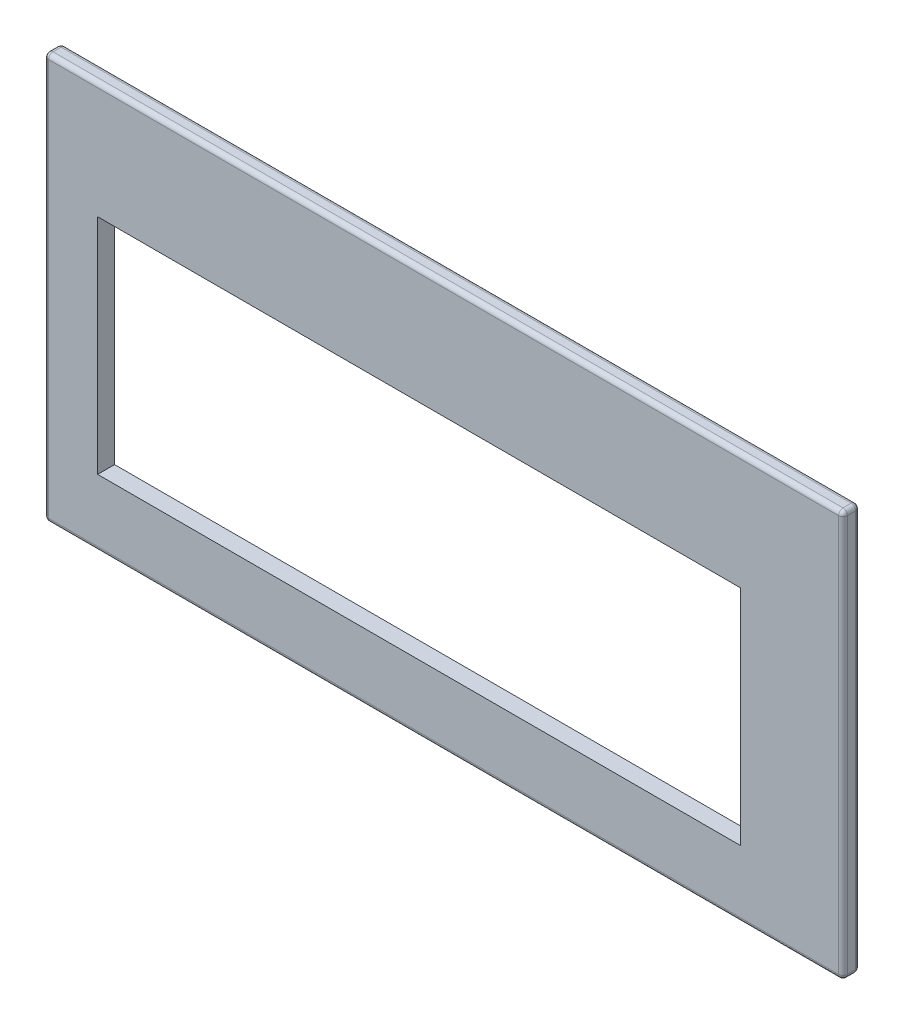
ISO-10303-21;
HEADER;
FILE_DESCRIPTION(('STEP AP214'),'2;1');
FILE_NAME('part.step','',(''),(''),'','','');
FILE_SCHEMA(('AUTOMOTIVE_DESIGN { 1 0 10303 214 1 1 1 1 }'));
ENDSEC;
DATA;
#1=APPLICATION_CONTEXT('core data for automotive mechanical design processes');
#2=APPLICATION_PROTOCOL_DEFINITION('international standard','automotive_design',2000,#1);
#3=PRODUCT_CONTEXT('',#1,'mechanical');
#4=PRODUCT('Part','Part','',(#3));
#5=PRODUCT_RELATED_PRODUCT_CATEGORY('part','',(#4));
#6=PRODUCT_DEFINITION_FORMATION('','',#4);
#7=PRODUCT_DEFINITION_CONTEXT('part definition',#1,'design');
#8=PRODUCT_DEFINITION('design','',#6,#7);
#9=PRODUCT_DEFINITION_SHAPE('','',#8);
#10=(LENGTH_UNIT() NAMED_UNIT(*) SI_UNIT(.MILLI.,.METRE.));
#11=(NAMED_UNIT(*) PLANE_ANGLE_UNIT() SI_UNIT($,.RADIAN.));
#12=(NAMED_UNIT(*) SI_UNIT($,.STERADIAN.) SOLID_ANGLE_UNIT());
#13=UNCERTAINTY_MEASURE_WITH_UNIT(LENGTH_MEASURE(1.E-05),#10,'distance_accuracy_value','');
#14=(GEOMETRIC_REPRESENTATION_CONTEXT(3) GLOBAL_UNCERTAINTY_ASSIGNED_CONTEXT((#13)) GLOBAL_UNIT_ASSIGNED_CONTEXT((#10,
#11,#12)) REPRESENTATION_CONTEXT('',''));
#15=CARTESIAN_POINT('',(0.,0.,0.));
#16=DIRECTION('',(0.,0.,1.));
#17=DIRECTION('',(1.,0.,0.));
#18=AXIS2_PLACEMENT_3D('',#15,#16,#17);
#19=CARTESIAN_POINT('',(-67.1122974680068,13.7448874974826,1.9));
#20=DIRECTION('',(1.,0.,0.));
#21=DIRECTION('',(0.,1.,0.));
#22=AXIS2_PLACEMENT_3D('',#19,#20,#21);
#23=PLANE('',#22);
#24=DIRECTION('',(0.,-1.,0.));
#25=VECTOR('',#24,1.);
#26=CARTESIAN_POINT('',(-67.1122974680068,13.7448874974826,1.4));
#27=LINE('',#26,#25);
#28=CARTESIAN_POINT('',(-67.1122974680068,-31.2551125025173,1.4));
#29=VERTEX_POINT('',#28);
#30=CARTESIAN_POINT('',(-67.1122974680068,13.2448874974826,1.4));
#31=VERTEX_POINT('',#30);
#32=EDGE_CURVE('E268',#29,#31,#27,.F.);
#33=ORIENTED_EDGE('',*,*,#32,.T.);
#34=DIRECTION('',(0.,0.,-1.));
#35=VECTOR('',#34,1.);
#36=CARTESIAN_POINT('',(-67.1122974680068,13.2448874974826,1.9));
#37=LINE('',#36,#35);
#38=CARTESIAN_POINT('',(-67.1122974680068,13.2448874974826,0.5));
#39=VERTEX_POINT('',#38);
#40=EDGE_CURVE('E271',#31,#39,#37,.T.);
#41=ORIENTED_EDGE('',*,*,#40,.T.);
#42=DIRECTION('',(0.,-1.,0.));
#43=VECTOR('',#42,1.);
#44=CARTESIAN_POINT('',(-67.1122974680068,13.7448874974826,0.5));
#45=LINE('',#44,#43);
#46=CARTESIAN_POINT('',(-67.1122974680068,-31.2551125025173,0.5));
#47=VERTEX_POINT('',#46);
#48=EDGE_CURVE('E260',#39,#47,#45,.T.);
#49=ORIENTED_EDGE('',*,*,#48,.T.);
#50=DIRECTION('',(0.,0.,-1.));
#51=VECTOR('',#50,1.);
#52=CARTESIAN_POINT('',(-67.1122974680068,-31.2551125025173,1.9));
#53=LINE('',#52,#51);
#54=EDGE_CURVE('E264',#47,#29,#53,.F.);
#55=ORIENTED_EDGE('',*,*,#54,.T.);
#56=EDGE_LOOP('',(#33,#41,#49,#55));
#57=FACE_BOUND('',#56,.T.);
#58=ADVANCED_FACE('F40',(#57),#23,.F.);
#59=CARTESIAN_POINT('',(-67.1122974680068,-31.7551125025173,1.9));
#60=DIRECTION('',(0.,1.,0.));
#61=DIRECTION('',(0.,0.,1.));
#62=AXIS2_PLACEMENT_3D('',#59,#60,#61);
#63=PLANE('',#62);
#64=DIRECTION('',(0.,0.,-1.));
#65=VECTOR('',#64,1.);
#66=CARTESIAN_POINT('',(21.8877025319932,-31.7551125025173,1.9));
#67=LINE('',#66,#65);
#68=CARTESIAN_POINT('',(21.8877025319932,-31.7551125025173,0.5));
#69=VERTEX_POINT('',#68);
#70=CARTESIAN_POINT('',(21.8877025319932,-31.7551125025173,1.4));
#71=VERTEX_POINT('',#70);
#72=EDGE_CURVE('E223',#69,#71,#67,.F.);
#73=ORIENTED_EDGE('',*,*,#72,.T.);
#74=DIRECTION('',(1.,0.,0.));
#75=VECTOR('',#74,1.);
#76=CARTESIAN_POINT('',(-66.6122974680068,-31.7551125025173,1.4));
#77=LINE('',#76,#75);
#78=CARTESIAN_POINT('',(-66.6122974680068,-31.7551125025173,1.4));
#79=VERTEX_POINT('',#78);
#80=EDGE_CURVE('E50',#71,#79,#77,.F.);
#81=ORIENTED_EDGE('',*,*,#80,.T.);
#82=DIRECTION('',(0.,0.,-1.));
#83=VECTOR('',#82,1.);
#84=CARTESIAN_POINT('',(-66.6122974680068,-31.7551125025173,1.9));
#85=LINE('',#84,#83);
#86=CARTESIAN_POINT('',(-66.6122974680068,-31.7551125025173,0.5));
#87=VERTEX_POINT('',#86);
#88=EDGE_CURVE('E219',#79,#87,#85,.T.);
#89=ORIENTED_EDGE('',*,*,#88,.T.);
#90=DIRECTION('',(1.,0.,0.));
#91=VECTOR('',#90,1.);
#92=CARTESIAN_POINT('',(-67.1122974680068,-31.7551125025173,0.5));
#93=LINE('',#92,#91);
#94=EDGE_CURVE('E350',#87,#69,#93,.T.);
#95=ORIENTED_EDGE('',*,*,#94,.T.);
#96=EDGE_LOOP('',(#73,#81,#89,#95));
#97=FACE_BOUND('',#96,.T.);
#98=ADVANCED_FACE('F405',(#97),#63,.F.);
#99=CARTESIAN_POINT('',(22.3877025319932,13.7448874974826,1.9));
#100=DIRECTION('',(-1.,0.,0.));
#101=DIRECTION('',(0.,-1.,0.));
#102=AXIS2_PLACEMENT_3D('',#99,#100,#101);
#103=PLANE('',#102);
#104=DIRECTION('',(0.,1.,0.));
#105=VECTOR('',#104,1.);
#106=CARTESIAN_POINT('',(22.3877025319932,-31.7551125025173,1.4));
#107=LINE('',#106,#105);
#108=CARTESIAN_POINT('',(22.3877025319932,13.2448874974826,1.4));
#109=VERTEX_POINT('',#108);
#110=CARTESIAN_POINT('',(22.3877025319932,-31.2551125025173,1.4));
#111=VERTEX_POINT('',#110);
#112=EDGE_CURVE('E211',#109,#111,#107,.F.);
#113=ORIENTED_EDGE('',*,*,#112,.T.);
#114=DIRECTION('',(0.,0.,-1.));
#115=VECTOR('',#114,1.);
#116=CARTESIAN_POINT('',(22.3877025319932,-31.2551125025173,1.9));
#117=LINE('',#116,#115);
#118=CARTESIAN_POINT('',(22.3877025319932,-31.2551125025173,0.5));
#119=VERTEX_POINT('',#118);
#120=EDGE_CURVE('E215',#111,#119,#117,.T.);
#121=ORIENTED_EDGE('',*,*,#120,.T.);
#122=DIRECTION('',(0.,1.,0.));
#123=VECTOR('',#122,1.);
#124=CARTESIAN_POINT('',(22.3877025319932,13.7448874974826,0.5));
#125=LINE('',#124,#123);
#126=CARTESIAN_POINT('',(22.3877025319932,13.2448874974826,0.5));
#127=VERTEX_POINT('',#126);
#128=EDGE_CURVE('E207',#119,#127,#125,.T.);
#129=ORIENTED_EDGE('',*,*,#128,.T.);
#130=DIRECTION('',(0.,0.,-1.));
#131=VECTOR('',#130,1.);
#132=CARTESIAN_POINT('',(22.3877025319932,13.2448874974826,1.9));
#133=LINE('',#132,#131);
#134=EDGE_CURVE('E204',#127,#109,#133,.F.);
#135=ORIENTED_EDGE('',*,*,#134,.T.);
#136=EDGE_LOOP('',(#113,#121,#129,#135));
#137=FACE_BOUND('',#136,.T.);
#138=ADVANCED_FACE('F387',(#137),#103,.F.);
#139=CARTESIAN_POINT('',(-67.1122974680068,13.7448874974826,1.9));
#140=DIRECTION('',(0.,-1.,0.));
#141=DIRECTION('',(0.,0.,-1.));
#142=AXIS2_PLACEMENT_3D('',#139,#140,#141);
#143=PLANE('',#142);
#144=DIRECTION('',(-1.,0.,0.));
#145=VECTOR('',#144,1.);
#146=CARTESIAN_POINT('',(22.3877025319932,13.7448874974826,1.4));
#147=LINE('',#146,#145);
#148=CARTESIAN_POINT('',(-66.6122974680068,13.7448874974826,1.4));
#149=VERTEX_POINT('',#148);
#150=CARTESIAN_POINT('',(21.8877025319932,13.7448874974826,1.4));
#151=VERTEX_POINT('',#150);
#152=EDGE_CURVE('E253',#149,#151,#147,.F.);
#153=ORIENTED_EDGE('',*,*,#152,.T.);
#154=DIRECTION('',(0.,0.,-1.));
#155=VECTOR('',#154,1.);
#156=CARTESIAN_POINT('',(21.8877025319932,13.7448874974826,1.9));
#157=LINE('',#156,#155);
#158=CARTESIAN_POINT('',(21.8877025319932,13.7448874974826,0.5));
#159=VERTEX_POINT('',#158);
#160=EDGE_CURVE('E256',#151,#159,#157,.T.);
#161=ORIENTED_EDGE('',*,*,#160,.T.);
#162=DIRECTION('',(-1.,0.,0.));
#163=VECTOR('',#162,1.);
#164=CARTESIAN_POINT('',(-67.1122974680068,13.7448874974826,0.5));
#165=LINE('',#164,#163);
#166=CARTESIAN_POINT('',(-66.6122974680068,13.7448874974826,0.5));
#167=VERTEX_POINT('',#166);
#168=EDGE_CURVE('E250',#159,#167,#165,.T.);
#169=ORIENTED_EDGE('',*,*,#168,.T.);
#170=DIRECTION('',(0.,0.,-1.));
#171=VECTOR('',#170,1.);
#172=CARTESIAN_POINT('',(-66.6122974680068,13.7448874974826,1.9));
#173=LINE('',#172,#171);
#174=EDGE_CURVE('E247',#167,#149,#173,.F.);
#175=ORIENTED_EDGE('',*,*,#174,.T.);
#176=EDGE_LOOP('',(#153,#161,#169,#175));
#177=FACE_BOUND('',#176,.T.);
#178=ADVANCED_FACE('F434',(#177),#143,.F.);
#179=CARTESIAN_POINT('',(0.,0.,1.9));
#180=DIRECTION('',(0.,0.,1.));
#181=DIRECTION('',(1.,0.,0.));
#182=AXIS2_PLACEMENT_3D('',#179,#180,#181);
#183=PLANE('',#182);
#184=DIRECTION('',(0.,-1.,0.));
#185=VECTOR('',#184,1.);
#186=CARTESIAN_POINT('',(-61.1122974680068,0.,1.9));
#187=LINE('',#186,#185);
#188=CARTESIAN_POINT('',(-61.1122974680068,0.744887497482652,1.9));
#189=VERTEX_POINT('',#188);
#190=CARTESIAN_POINT('',(-61.1122974680068,-24.2551125025173,1.9));
#191=VERTEX_POINT('',#190);
#192=EDGE_CURVE('E161',#189,#191,#187,.T.);
#193=ORIENTED_EDGE('',*,*,#192,.F.);
#194=DIRECTION('',(-1.,0.,0.));
#195=VECTOR('',#194,1.);
#196=CARTESIAN_POINT('',(0.,0.744887497482652,1.9));
#197=LINE('',#196,#195);
#198=CARTESIAN_POINT('',(10.8877025319932,0.744887497482652,1.9));
#199=VERTEX_POINT('',#198);
#200=EDGE_CURVE('E198',#199,#189,#197,.T.);
#201=ORIENTED_EDGE('',*,*,#200,.F.);
#202=DIRECTION('',(0.,1.,0.));
#203=VECTOR('',#202,1.);
#204=CARTESIAN_POINT('',(10.8877025319932,0.,1.9));
#205=LINE('',#204,#203);
#206=CARTESIAN_POINT('',(10.8877025319932,-24.2551125025173,1.9));
#207=VERTEX_POINT('',#206);
#208=EDGE_CURVE('E195',#207,#199,#205,.T.);
#209=ORIENTED_EDGE('',*,*,#208,.F.);
#210=DIRECTION('',(1.,0.,0.));
#211=VECTOR('',#210,1.);
#212=CARTESIAN_POINT('',(0.,-24.2551125025173,1.9));
#213=LINE('',#212,#211);
#214=EDGE_CURVE('E186',#191,#207,#213,.T.);
#215=ORIENTED_EDGE('',*,*,#214,.F.);
#216=EDGE_LOOP('',(#193,#201,#209,#215));
#217=FACE_BOUND('',#216,.T.);
#218=DIRECTION('',(0.,-1.,0.));
#219=VECTOR('',#218,1.);
#220=CARTESIAN_POINT('',(-66.6122974680068,-31.7551125025173,1.9));
#221=LINE('',#220,#219);
#222=CARTESIAN_POINT('',(-66.6122974680068,13.2448874974826,1.9));
#223=VERTEX_POINT('',#222);
#224=CARTESIAN_POINT('',(-66.6122974680068,-31.2551125025173,1.9));
#225=VERTEX_POINT('',#224);
#226=EDGE_CURVE('E227',#223,#225,#221,.T.);
#227=ORIENTED_EDGE('',*,*,#226,.T.);
#228=DIRECTION('',(1.,0.,0.));
#229=VECTOR('',#228,1.);
#230=CARTESIAN_POINT('',(21.8877025319932,-31.2551125025173,1.9));
#231=LINE('',#230,#229);
#232=CARTESIAN_POINT('',(21.8877025319932,-31.2551125025173,1.9));
#233=VERTEX_POINT('',#232);
#234=EDGE_CURVE('E347',#225,#233,#231,.T.);
#235=ORIENTED_EDGE('',*,*,#234,.T.);
#236=DIRECTION('',(0.,1.,0.));
#237=VECTOR('',#236,1.);
#238=CARTESIAN_POINT('',(21.8877025319932,13.7448874974826,1.9));
#239=LINE('',#238,#237);
#240=CARTESIAN_POINT('',(21.8877025319932,13.2448874974826,1.9));
#241=VERTEX_POINT('',#240);
#242=EDGE_CURVE('E234',#233,#241,#239,.T.);
#243=ORIENTED_EDGE('',*,*,#242,.T.);
#244=DIRECTION('',(-1.,0.,0.));
#245=VECTOR('',#244,1.);
#246=CARTESIAN_POINT('',(-67.1122974680068,13.2448874974826,1.9));
#247=LINE('',#246,#245);
#248=EDGE_CURVE('E231',#241,#223,#247,.T.);
#249=ORIENTED_EDGE('',*,*,#248,.T.);
#250=EDGE_LOOP('',(#227,#235,#243,#249));
#251=FACE_BOUND('',#250,.T.);
#252=ADVANCED_FACE('F419',(#217,#251),#183,.T.);
#253=CARTESIAN_POINT('',(0.,0.,0.));
#254=DIRECTION('',(0.,0.,1.));
#255=DIRECTION('',(1.,0.,0.));
#256=AXIS2_PLACEMENT_3D('',#253,#254,#255);
#257=PLANE('',#256);
#258=DIRECTION('',(-1.,0.,0.));
#259=VECTOR('',#258,1.);
#260=CARTESIAN_POINT('',(-61.1122974680068,0.744887497482652,0.));
#261=LINE('',#260,#259);
#262=CARTESIAN_POINT('',(10.8877025319932,0.744887497482652,0.));
#263=VERTEX_POINT('',#262);
#264=CARTESIAN_POINT('',(-61.1122974680068,0.744887497482652,0.));
#265=VERTEX_POINT('',#264);
#266=EDGE_CURVE('E165',#263,#265,#261,.T.);
#267=ORIENTED_EDGE('',*,*,#266,.T.);
#268=DIRECTION('',(0.,-1.,0.));
#269=VECTOR('',#268,1.);
#270=CARTESIAN_POINT('',(-61.1122974680068,0.744887497482652,0.));
#271=LINE('',#270,#269);
#272=CARTESIAN_POINT('',(-61.1122974680068,-24.2551125025173,0.));
#273=VERTEX_POINT('',#272);
#274=EDGE_CURVE('E158',#265,#273,#271,.T.);
#275=ORIENTED_EDGE('',*,*,#274,.T.);
#276=DIRECTION('',(1.,0.,0.));
#277=VECTOR('',#276,1.);
#278=CARTESIAN_POINT('',(-61.1122974680068,-24.2551125025173,0.));
#279=LINE('',#278,#277);
#280=CARTESIAN_POINT('',(10.8877025319932,-24.2551125025173,0.));
#281=VERTEX_POINT('',#280);
#282=EDGE_CURVE('E168',#273,#281,#279,.T.);
#283=ORIENTED_EDGE('',*,*,#282,.T.);
#284=DIRECTION('',(0.,1.,0.));
#285=VECTOR('',#284,1.);
#286=CARTESIAN_POINT('',(10.8877025319932,0.744887497482652,0.));
#287=LINE('',#286,#285);
#288=EDGE_CURVE('E66',#281,#263,#287,.T.);
#289=ORIENTED_EDGE('',*,*,#288,.T.);
#290=EDGE_LOOP('',(#267,#275,#283,#289));
#291=FACE_BOUND('',#290,.T.);
#292=DIRECTION('',(0.,1.,0.));
#293=VECTOR('',#292,1.);
#294=CARTESIAN_POINT('',(21.8877025319932,0.,0.));
#295=LINE('',#294,#293);
#296=CARTESIAN_POINT('',(21.8877025319932,13.2448874974826,0.));
#297=VERTEX_POINT('',#296);
#298=CARTESIAN_POINT('',(21.8877025319932,-31.2551125025173,0.));
#299=VERTEX_POINT('',#298);
#300=EDGE_CURVE('E243',#297,#299,#295,.F.);
#301=ORIENTED_EDGE('',*,*,#300,.T.);
#302=DIRECTION('',(1.,0.,0.));
#303=VECTOR('',#302,1.);
#304=CARTESIAN_POINT('',(0.,-31.2551125025173,0.));
#305=LINE('',#304,#303);
#306=CARTESIAN_POINT('',(-66.6122974680068,-31.2551125025173,0.));
#307=VERTEX_POINT('',#306);
#308=EDGE_CURVE('E11',#299,#307,#305,.F.);
#309=ORIENTED_EDGE('',*,*,#308,.T.);
#310=DIRECTION('',(0.,-1.,0.));
#311=VECTOR('',#310,1.);
#312=CARTESIAN_POINT('',(-66.6122974680068,0.,0.));
#313=LINE('',#312,#311);
#314=CARTESIAN_POINT('',(-66.6122974680068,13.2448874974826,0.));
#315=VERTEX_POINT('',#314);
#316=EDGE_CURVE('E237',#307,#315,#313,.F.);
#317=ORIENTED_EDGE('',*,*,#316,.T.);
#318=DIRECTION('',(-1.,0.,0.));
#319=VECTOR('',#318,1.);
#320=CARTESIAN_POINT('',(0.,13.2448874974826,0.));
#321=LINE('',#320,#319);
#322=EDGE_CURVE('E240',#315,#297,#321,.F.);
#323=ORIENTED_EDGE('',*,*,#322,.T.);
#324=EDGE_LOOP('',(#301,#309,#317,#323));
#325=FACE_BOUND('',#324,.T.);
#326=ADVANCED_FACE('F173',(#291,#325),#257,.F.);
#327=CARTESIAN_POINT('',(-66.6122974680068,-31.2551125025173,1.9));
#328=DIRECTION('',(0.,0.,-1.));
#329=DIRECTION('',(-1.,0.,0.));
#330=AXIS2_PLACEMENT_3D('',#327,#328,#329);
#331=CYLINDRICAL_SURFACE('',#330,0.5);
#332=ORIENTED_EDGE('',*,*,#88,.F.);
#333=CARTESIAN_POINT('',(-66.6122974680068,-31.2551125025173,1.4));
#334=DIRECTION('',(0.,0.,-1.));
#335=DIRECTION('',(-1.,0.,0.));
#336=AXIS2_PLACEMENT_3D('',#333,#334,#335);
#337=CIRCLE('',#336,0.5);
#338=EDGE_CURVE('E328',#79,#29,#337,.T.);
#339=ORIENTED_EDGE('',*,*,#338,.T.);
#340=ORIENTED_EDGE('',*,*,#54,.F.);
#341=CARTESIAN_POINT('',(-66.6122974680068,-31.2551125025173,0.5));
#342=DIRECTION('',(0.,0.,-1.));
#343=DIRECTION('',(-1.,0.,0.));
#344=AXIS2_PLACEMENT_3D('',#341,#342,#343);
#345=CIRCLE('',#344,0.5);
#346=EDGE_CURVE('E325',#47,#87,#345,.F.);
#347=ORIENTED_EDGE('',*,*,#346,.T.);
#348=EDGE_LOOP('',(#332,#339,#340,#347));
#349=FACE_BOUND('',#348,.T.);
#350=ADVANCED_FACE('F408',(#349),#331,.T.);
#351=CARTESIAN_POINT('',(-66.6122974680068,0.,1.4));
#352=DIRECTION('',(0.,1.,0.));
#353=DIRECTION('',(-1.,0.,0.));
#354=AXIS2_PLACEMENT_3D('',#351,#352,#353);
#355=CYLINDRICAL_SURFACE('',#354,0.5);
#356=ORIENTED_EDGE('',*,*,#32,.F.);
#357=CARTESIAN_POINT('',(-66.6122974680068,-31.2551125025173,1.4));
#358=DIRECTION('',(0.,1.,0.));
#359=DIRECTION('',(-1.,0.,0.));
#360=AXIS2_PLACEMENT_3D('',#357,#358,#359);
#361=CIRCLE('',#360,0.5);
#362=EDGE_CURVE('E275',#29,#225,#361,.T.);
#363=ORIENTED_EDGE('',*,*,#362,.T.);
#364=ORIENTED_EDGE('',*,*,#226,.F.);
#365=CARTESIAN_POINT('',(-66.6122974680068,13.2448874974826,1.4));
#366=DIRECTION('',(0.,1.,0.));
#367=DIRECTION('',(0.,0.,1.));
#368=AXIS2_PLACEMENT_3D('',#365,#366,#367);
#369=CIRCLE('',#368,0.5);
#370=EDGE_CURVE('E208',#31,#223,#369,.T.);
#371=ORIENTED_EDGE('',*,*,#370,.F.);
#372=EDGE_LOOP('',(#356,#363,#364,#371));
#373=FACE_BOUND('',#372,.T.);
#374=ADVANCED_FACE('F416',(#373),#355,.T.);
#375=CARTESIAN_POINT('',(-66.6122974680068,13.2448874974826,1.9));
#376=DIRECTION('',(0.,0.,-1.));
#377=DIRECTION('',(-1.,0.,0.));
#378=AXIS2_PLACEMENT_3D('',#375,#376,#377);
#379=CYLINDRICAL_SURFACE('',#378,0.5);
#380=CARTESIAN_POINT('',(-66.6122974680068,13.2448874974826,0.5));
#381=DIRECTION('',(0.,0.,-1.));
#382=DIRECTION('',(-1.,0.,0.));
#383=AXIS2_PLACEMENT_3D('',#380,#381,#382);
#384=CIRCLE('',#383,0.5);
#385=EDGE_CURVE('E311',#39,#167,#384,.T.);
#386=ORIENTED_EDGE('',*,*,#385,.F.);
#387=ORIENTED_EDGE('',*,*,#40,.F.);
#388=CARTESIAN_POINT('',(-66.6122974680068,13.2448874974826,1.4));
#389=DIRECTION('',(0.,0.,1.));
#390=DIRECTION('',(1.,0.,0.));
#391=AXIS2_PLACEMENT_3D('',#388,#389,#390);
#392=CIRCLE('',#391,0.5);
#393=EDGE_CURVE('E315',#149,#31,#392,.T.);
#394=ORIENTED_EDGE('',*,*,#393,.F.);
#395=ORIENTED_EDGE('',*,*,#174,.F.);
#396=EDGE_LOOP('',(#386,#387,#394,#395));
#397=FACE_BOUND('',#396,.T.);
#398=ADVANCED_FACE('F440',(#397),#379,.T.);
#399=CARTESIAN_POINT('',(-66.6122974680068,13.7448874974826,0.5));
#400=DIRECTION('',(0.,-1.,0.));
#401=DIRECTION('',(1.,0.,0.));
#402=AXIS2_PLACEMENT_3D('',#399,#400,#401);
#403=CYLINDRICAL_SURFACE('',#402,0.5);
#404=ORIENTED_EDGE('',*,*,#316,.F.);
#405=CARTESIAN_POINT('',(-66.6122974680068,-31.2551125025173,0.5));
#406=DIRECTION('',(0.,-1.,0.));
#407=DIRECTION('',(1.,0.,0.));
#408=AXIS2_PLACEMENT_3D('',#405,#406,#407);
#409=CIRCLE('',#408,0.5);
#410=EDGE_CURVE('E340',#307,#47,#409,.F.);
#411=ORIENTED_EDGE('',*,*,#410,.T.);
#412=ORIENTED_EDGE('',*,*,#48,.F.);
#413=CARTESIAN_POINT('',(-66.6122974680068,13.2448874974826,0.5));
#414=DIRECTION('',(0.,1.,0.));
#415=DIRECTION('',(0.,0.,1.));
#416=AXIS2_PLACEMENT_3D('',#413,#414,#415);
#417=CIRCLE('',#416,0.5);
#418=EDGE_CURVE('E308',#315,#39,#417,.T.);
#419=ORIENTED_EDGE('',*,*,#418,.F.);
#420=EDGE_LOOP('',(#404,#411,#412,#419));
#421=FACE_BOUND('',#420,.T.);
#422=ADVANCED_FACE('F445',(#421),#403,.T.);
#423=CARTESIAN_POINT('',(-66.6122974680068,13.2448874974826,1.4));
#424=DIRECTION('',(-1.,0.,0.));
#425=DIRECTION('',(0.,0.,1.));
#426=AXIS2_PLACEMENT_3D('',#423,#424,#425);
#427=SPHERICAL_SURFACE('',#426,0.5);
#428=ORIENTED_EDGE('',*,*,#393,.T.);
#429=ORIENTED_EDGE('',*,*,#370,.T.);
#430=CARTESIAN_POINT('',(-66.6122974680068,13.2448874974826,1.4));
#431=DIRECTION('',(-1.,0.,0.));
#432=DIRECTION('',(0.,0.,1.));
#433=AXIS2_PLACEMENT_3D('',#430,#431,#432);
#434=CIRCLE('',#433,0.5);
#435=EDGE_CURVE('E304',#149,#223,#434,.F.);
#436=ORIENTED_EDGE('',*,*,#435,.F.);
#437=EDGE_LOOP('',(#428,#429,#436));
#438=FACE_BOUND('',#437,.T.);
#439=ADVANCED_FACE('F442',(#438),#427,.T.);
#440=CARTESIAN_POINT('',(-66.6122974680068,13.2448874974826,0.5));
#441=DIRECTION('',(-1.,0.,0.));
#442=DIRECTION('',(0.,0.,1.));
#443=AXIS2_PLACEMENT_3D('',#440,#441,#442);
#444=SPHERICAL_SURFACE('',#443,0.5);
#445=ORIENTED_EDGE('',*,*,#418,.T.);
#446=ORIENTED_EDGE('',*,*,#385,.T.);
#447=CARTESIAN_POINT('',(-66.6122974680068,13.2448874974826,0.5));
#448=DIRECTION('',(-1.,0.,0.));
#449=DIRECTION('',(0.,0.,1.));
#450=AXIS2_PLACEMENT_3D('',#447,#448,#449);
#451=CIRCLE('',#450,0.5);
#452=EDGE_CURVE('E300',#315,#167,#451,.F.);
#453=ORIENTED_EDGE('',*,*,#452,.F.);
#454=EDGE_LOOP('',(#445,#446,#453));
#455=FACE_BOUND('',#454,.T.);
#456=ADVANCED_FACE('F444',(#455),#444,.T.);
#457=CARTESIAN_POINT('',(0.,13.2448874974826,1.4));
#458=DIRECTION('',(1.,0.,0.));
#459=DIRECTION('',(0.,0.,-1.));
#460=AXIS2_PLACEMENT_3D('',#457,#458,#459);
#461=CYLINDRICAL_SURFACE('',#460,0.5);
#462=ORIENTED_EDGE('',*,*,#435,.T.);
#463=ORIENTED_EDGE('',*,*,#248,.F.);
#464=CARTESIAN_POINT('',(21.8877025319932,13.2448874974826,1.4));
#465=DIRECTION('',(1.,0.,0.));
#466=DIRECTION('',(0.,0.,-1.));
#467=AXIS2_PLACEMENT_3D('',#464,#465,#466);
#468=CIRCLE('',#467,0.5);
#469=EDGE_CURVE('E296',#151,#241,#468,.T.);
#470=ORIENTED_EDGE('',*,*,#469,.F.);
#471=ORIENTED_EDGE('',*,*,#152,.F.);
#472=EDGE_LOOP('',(#462,#463,#470,#471));
#473=FACE_BOUND('',#472,.T.);
#474=ADVANCED_FACE('F423',(#473),#461,.T.);
#475=CARTESIAN_POINT('',(21.8877025319932,13.2448874974826,1.9));
#476=DIRECTION('',(0.,0.,-1.));
#477=DIRECTION('',(-1.,0.,0.));
#478=AXIS2_PLACEMENT_3D('',#475,#476,#477);
#479=CYLINDRICAL_SURFACE('',#478,0.5);
#480=CARTESIAN_POINT('',(21.8877025319932,13.2448874974826,0.5));
#481=DIRECTION('',(0.,0.,-1.));
#482=DIRECTION('',(-1.,0.,0.));
#483=AXIS2_PLACEMENT_3D('',#480,#481,#482);
#484=CIRCLE('',#483,0.5);
#485=EDGE_CURVE('E288',#159,#127,#484,.T.);
#486=ORIENTED_EDGE('',*,*,#485,.F.);
#487=ORIENTED_EDGE('',*,*,#160,.F.);
#488=CARTESIAN_POINT('',(21.8877025319932,13.2448874974826,1.4));
#489=DIRECTION('',(0.,0.,1.));
#490=DIRECTION('',(1.,0.,0.));
#491=AXIS2_PLACEMENT_3D('',#488,#489,#490);
#492=CIRCLE('',#491,0.5);
#493=EDGE_CURVE('E292',#109,#151,#492,.T.);
#494=ORIENTED_EDGE('',*,*,#493,.F.);
#495=ORIENTED_EDGE('',*,*,#134,.F.);
#496=EDGE_LOOP('',(#486,#487,#494,#495));
#497=FACE_BOUND('',#496,.T.);
#498=ADVANCED_FACE('F431',(#497),#479,.T.);
#499=CARTESIAN_POINT('',(-67.1122974680068,13.2448874974826,0.5));
#500=DIRECTION('',(-1.,0.,0.));
#501=DIRECTION('',(0.,0.,1.));
#502=AXIS2_PLACEMENT_3D('',#499,#500,#501);
#503=CYLINDRICAL_SURFACE('',#502,0.5);
#504=ORIENTED_EDGE('',*,*,#452,.T.);
#505=ORIENTED_EDGE('',*,*,#168,.F.);
#506=CARTESIAN_POINT('',(21.8877025319932,13.2448874974826,0.5));
#507=DIRECTION('',(1.,0.,0.));
#508=DIRECTION('',(0.,0.,-1.));
#509=AXIS2_PLACEMENT_3D('',#506,#507,#508);
#510=CIRCLE('',#509,0.5);
#511=EDGE_CURVE('E285',#297,#159,#510,.T.);
#512=ORIENTED_EDGE('',*,*,#511,.F.);
#513=ORIENTED_EDGE('',*,*,#322,.F.);
#514=EDGE_LOOP('',(#504,#505,#512,#513));
#515=FACE_BOUND('',#514,.T.);
#516=ADVANCED_FACE('F477',(#515),#503,.T.);
#517=CARTESIAN_POINT('',(21.8877025319932,13.2448874974826,1.4));
#518=DIRECTION('',(0.,1.,0.));
#519=DIRECTION('',(0.,0.,1.));
#520=AXIS2_PLACEMENT_3D('',#517,#518,#519);
#521=SPHERICAL_SURFACE('',#520,0.5);
#522=ORIENTED_EDGE('',*,*,#493,.T.);
#523=ORIENTED_EDGE('',*,*,#469,.T.);
#524=CARTESIAN_POINT('',(21.8877025319932,13.2448874974826,1.4));
#525=DIRECTION('',(0.,1.,0.));
#526=DIRECTION('',(0.,0.,1.));
#527=AXIS2_PLACEMENT_3D('',#524,#525,#526);
#528=CIRCLE('',#527,0.5);
#529=EDGE_CURVE('E280',#109,#241,#528,.F.);
#530=ORIENTED_EDGE('',*,*,#529,.F.);
#531=EDGE_LOOP('',(#522,#523,#530));
#532=FACE_BOUND('',#531,.T.);
#533=ADVANCED_FACE('F427',(#532),#521,.T.);
#534=CARTESIAN_POINT('',(21.8877025319932,13.2448874974826,0.5));
#535=DIRECTION('',(0.,1.,0.));
#536=DIRECTION('',(0.,0.,1.));
#537=AXIS2_PLACEMENT_3D('',#534,#535,#536);
#538=SPHERICAL_SURFACE('',#537,0.5);
#539=ORIENTED_EDGE('',*,*,#511,.T.);
#540=ORIENTED_EDGE('',*,*,#485,.T.);
#541=CARTESIAN_POINT('',(21.8877025319932,13.2448874974826,0.5));
#542=DIRECTION('',(0.,1.,0.));
#543=DIRECTION('',(0.,0.,1.));
#544=AXIS2_PLACEMENT_3D('',#541,#542,#543);
#545=CIRCLE('',#544,0.5);
#546=EDGE_CURVE('E276',#297,#127,#545,.F.);
#547=ORIENTED_EDGE('',*,*,#546,.F.);
#548=EDGE_LOOP('',(#539,#540,#547));
#549=FACE_BOUND('',#548,.T.);
#550=ADVANCED_FACE('F471',(#549),#538,.T.);
#551=CARTESIAN_POINT('',(21.8877025319932,0.,1.4));
#552=DIRECTION('',(0.,-1.,0.));
#553=DIRECTION('',(1.,0.,0.));
#554=AXIS2_PLACEMENT_3D('',#551,#552,#553);
#555=CYLINDRICAL_SURFACE('',#554,0.5);
#556=ORIENTED_EDGE('',*,*,#242,.F.);
#557=CARTESIAN_POINT('',(21.8877025319932,-31.2551125025173,1.4));
#558=DIRECTION('',(0.,-1.,0.));
#559=DIRECTION('',(1.,0.,0.));
#560=AXIS2_PLACEMENT_3D('',#557,#558,#559);
#561=CIRCLE('',#560,0.5);
#562=EDGE_CURVE('E337',#233,#111,#561,.F.);
#563=ORIENTED_EDGE('',*,*,#562,.T.);
#564=ORIENTED_EDGE('',*,*,#112,.F.);
#565=ORIENTED_EDGE('',*,*,#529,.T.);
#566=EDGE_LOOP('',(#556,#563,#564,#565));
#567=FACE_BOUND('',#566,.T.);
#568=ADVANCED_FACE('F392',(#567),#555,.T.);
#569=CARTESIAN_POINT('',(21.8877025319932,13.7448874974826,0.5));
#570=DIRECTION('',(0.,1.,0.));
#571=DIRECTION('',(-1.,0.,0.));
#572=AXIS2_PLACEMENT_3D('',#569,#570,#571);
#573=CYLINDRICAL_SURFACE('',#572,0.5);
#574=ORIENTED_EDGE('',*,*,#128,.F.);
#575=CARTESIAN_POINT('',(21.8877025319932,-31.2551125025173,0.5));
#576=DIRECTION('',(0.,1.,0.));
#577=DIRECTION('',(-1.,0.,0.));
#578=AXIS2_PLACEMENT_3D('',#575,#576,#577);
#579=CIRCLE('',#578,0.5);
#580=EDGE_CURVE('E344',#119,#299,#579,.T.);
#581=ORIENTED_EDGE('',*,*,#580,.T.);
#582=ORIENTED_EDGE('',*,*,#300,.F.);
#583=ORIENTED_EDGE('',*,*,#546,.T.);
#584=EDGE_LOOP('',(#574,#581,#582,#583));
#585=FACE_BOUND('',#584,.T.);
#586=ADVANCED_FACE('F382',(#585),#573,.T.);
#587=CARTESIAN_POINT('',(21.8877025319932,-31.2551125025173,1.9));
#588=DIRECTION('',(0.,0.,-1.));
#589=DIRECTION('',(-1.,0.,0.));
#590=AXIS2_PLACEMENT_3D('',#587,#588,#589);
#591=CYLINDRICAL_SURFACE('',#590,0.5);
#592=ORIENTED_EDGE('',*,*,#120,.F.);
#593=CARTESIAN_POINT('',(21.8877025319932,-31.2551125025173,1.4));
#594=DIRECTION('',(0.,0.,-1.));
#595=DIRECTION('',(-1.,0.,0.));
#596=AXIS2_PLACEMENT_3D('',#593,#594,#595);
#597=CIRCLE('',#596,0.5);
#598=EDGE_CURVE('E334',#111,#71,#597,.T.);
#599=ORIENTED_EDGE('',*,*,#598,.T.);
#600=ORIENTED_EDGE('',*,*,#72,.F.);
#601=CARTESIAN_POINT('',(21.8877025319932,-31.2551125025173,0.5));
#602=DIRECTION('',(0.,0.,-1.));
#603=DIRECTION('',(-1.,0.,0.));
#604=AXIS2_PLACEMENT_3D('',#601,#602,#603);
#605=CIRCLE('',#604,0.5);
#606=EDGE_CURVE('E331',#69,#119,#605,.F.);
#607=ORIENTED_EDGE('',*,*,#606,.T.);
#608=EDGE_LOOP('',(#592,#599,#600,#607));
#609=FACE_BOUND('',#608,.T.);
#610=ADVANCED_FACE('F379',(#609),#591,.T.);
#611=CARTESIAN_POINT('',(21.8877025319932,-31.2551125025173,1.4));
#612=DIRECTION('',(0.,0.,1.));
#613=DIRECTION('',(1.,0.,0.));
#614=AXIS2_PLACEMENT_3D('',#611,#612,#613);
#615=SPHERICAL_SURFACE('',#614,0.5);
#616=ORIENTED_EDGE('',*,*,#598,.F.);
#617=ORIENTED_EDGE('',*,*,#562,.F.);
#618=CARTESIAN_POINT('',(21.8877025319932,-31.2551125025173,1.4));
#619=DIRECTION('',(-1.,0.,0.));
#620=DIRECTION('',(0.,0.,1.));
#621=AXIS2_PLACEMENT_3D('',#618,#619,#620);
#622=CIRCLE('',#621,0.5);
#623=EDGE_CURVE('E281',#71,#233,#622,.T.);
#624=ORIENTED_EDGE('',*,*,#623,.F.);
#625=EDGE_LOOP('',(#616,#617,#624));
#626=FACE_BOUND('',#625,.T.);
#627=ADVANCED_FACE('F397',(#626),#615,.T.);
#628=CARTESIAN_POINT('',(0.,-31.2551125025173,1.4));
#629=DIRECTION('',(-1.,0.,0.));
#630=DIRECTION('',(0.,0.,1.));
#631=AXIS2_PLACEMENT_3D('',#628,#629,#630);
#632=CYLINDRICAL_SURFACE('',#631,0.5);
#633=ORIENTED_EDGE('',*,*,#623,.T.);
#634=ORIENTED_EDGE('',*,*,#234,.F.);
#635=CARTESIAN_POINT('',(-66.6122974680068,-31.2551125025173,1.4));
#636=DIRECTION('',(-1.,0.,0.));
#637=DIRECTION('',(0.,0.,1.));
#638=AXIS2_PLACEMENT_3D('',#635,#636,#637);
#639=CIRCLE('',#638,0.5);
#640=EDGE_CURVE('E355',#79,#225,#639,.T.);
#641=ORIENTED_EDGE('',*,*,#640,.F.);
#642=ORIENTED_EDGE('',*,*,#80,.F.);
#643=EDGE_LOOP('',(#633,#634,#641,#642));
#644=FACE_BOUND('',#643,.T.);
#645=ADVANCED_FACE('F401',(#644),#632,.T.);
#646=CARTESIAN_POINT('',(-66.6122974680068,-31.2551125025173,1.4));
#647=DIRECTION('',(0.,0.,1.));
#648=DIRECTION('',(1.,0.,0.));
#649=AXIS2_PLACEMENT_3D('',#646,#647,#648);
#650=SPHERICAL_SURFACE('',#649,0.5);
#651=ORIENTED_EDGE('',*,*,#362,.F.);
#652=ORIENTED_EDGE('',*,*,#338,.F.);
#653=ORIENTED_EDGE('',*,*,#640,.T.);
#654=EDGE_LOOP('',(#651,#652,#653));
#655=FACE_BOUND('',#654,.T.);
#656=ADVANCED_FACE('F412',(#655),#650,.T.);
#657=CARTESIAN_POINT('',(21.8877025319932,-31.2551125025173,0.5));
#658=DIRECTION('',(0.,0.,1.));
#659=DIRECTION('',(1.,0.,0.));
#660=AXIS2_PLACEMENT_3D('',#657,#658,#659);
#661=SPHERICAL_SURFACE('',#660,0.5);
#662=ORIENTED_EDGE('',*,*,#580,.F.);
#663=ORIENTED_EDGE('',*,*,#606,.F.);
#664=CARTESIAN_POINT('',(21.8877025319932,-31.2551125025173,0.5));
#665=DIRECTION('',(-1.,0.,0.));
#666=DIRECTION('',(0.,0.,1.));
#667=AXIS2_PLACEMENT_3D('',#664,#665,#666);
#668=CIRCLE('',#667,0.5);
#669=EDGE_CURVE('E44',#299,#69,#668,.T.);
#670=ORIENTED_EDGE('',*,*,#669,.F.);
#671=EDGE_LOOP('',(#662,#663,#670));
#672=FACE_BOUND('',#671,.T.);
#673=ADVANCED_FACE('F42',(#672),#661,.T.);
#674=CARTESIAN_POINT('',(-67.1122974680068,-31.2551125025173,0.5));
#675=DIRECTION('',(1.,0.,0.));
#676=DIRECTION('',(0.,0.,-1.));
#677=AXIS2_PLACEMENT_3D('',#674,#675,#676);
#678=CYLINDRICAL_SURFACE('',#677,0.5);
#679=ORIENTED_EDGE('',*,*,#669,.T.);
#680=ORIENTED_EDGE('',*,*,#94,.F.);
#681=CARTESIAN_POINT('',(-66.6122974680068,-31.2551125025173,0.5));
#682=DIRECTION('',(-1.,0.,0.));
#683=DIRECTION('',(0.,0.,1.));
#684=AXIS2_PLACEMENT_3D('',#681,#682,#683);
#685=CIRCLE('',#684,0.5);
#686=EDGE_CURVE('E203',#307,#87,#685,.T.);
#687=ORIENTED_EDGE('',*,*,#686,.F.);
#688=ORIENTED_EDGE('',*,*,#308,.F.);
#689=EDGE_LOOP('',(#679,#680,#687,#688));
#690=FACE_BOUND('',#689,.T.);
#691=ADVANCED_FACE('F371',(#690),#678,.T.);
#692=CARTESIAN_POINT('',(-66.6122974680068,-31.2551125025173,0.5));
#693=DIRECTION('',(0.,0.,1.));
#694=DIRECTION('',(1.,0.,0.));
#695=AXIS2_PLACEMENT_3D('',#692,#693,#694);
#696=SPHERICAL_SURFACE('',#695,0.5);
#697=ORIENTED_EDGE('',*,*,#686,.T.);
#698=ORIENTED_EDGE('',*,*,#346,.F.);
#699=ORIENTED_EDGE('',*,*,#410,.F.);
#700=EDGE_LOOP('',(#697,#698,#699));
#701=FACE_BOUND('',#700,.T.);
#702=ADVANCED_FACE('F545',(#701),#696,.T.);
#703=CARTESIAN_POINT('',(-61.1122974680068,0.744887497482652,0.));
#704=DIRECTION('',(-1.,0.,0.));
#705=DIRECTION('',(0.,-1.,0.));
#706=AXIS2_PLACEMENT_3D('',#703,#704,#705);
#707=PLANE('',#706);
#708=ORIENTED_EDGE('',*,*,#192,.T.);
#709=DIRECTION('',(0.,0.,1.));
#710=VECTOR('',#709,1.);
#711=CARTESIAN_POINT('',(-61.1122974680068,-24.2551125025173,0.));
#712=LINE('',#711,#710);
#713=EDGE_CURVE('E58',#273,#191,#712,.T.);
#714=ORIENTED_EDGE('',*,*,#713,.F.);
#715=ORIENTED_EDGE('',*,*,#274,.F.);
#716=DIRECTION('',(0.,0.,1.));
#717=VECTOR('',#716,1.);
#718=CARTESIAN_POINT('',(-61.1122974680068,0.744887497482652,0.));
#719=LINE('',#718,#717);
#720=EDGE_CURVE('E183',#265,#189,#719,.T.);
#721=ORIENTED_EDGE('',*,*,#720,.T.);
#722=EDGE_LOOP('',(#708,#714,#715,#721));
#723=FACE_BOUND('',#722,.T.);
#724=ADVANCED_FACE('F155',(#723),#707,.F.);
#725=CARTESIAN_POINT('',(-61.1122974680068,0.744887497482652,0.));
#726=DIRECTION('',(0.,1.,0.));
#727=DIRECTION('',(0.,0.,1.));
#728=AXIS2_PLACEMENT_3D('',#725,#726,#727);
#729=PLANE('',#728);
#730=ORIENTED_EDGE('',*,*,#200,.T.);
#731=ORIENTED_EDGE('',*,*,#720,.F.);
#732=ORIENTED_EDGE('',*,*,#266,.F.);
#733=DIRECTION('',(0.,0.,1.));
#734=VECTOR('',#733,1.);
#735=CARTESIAN_POINT('',(10.8877025319932,0.744887497482652,0.));
#736=LINE('',#735,#734);
#737=EDGE_CURVE('E187',#263,#199,#736,.T.);
#738=ORIENTED_EDGE('',*,*,#737,.T.);
#739=EDGE_LOOP('',(#730,#731,#732,#738));
#740=FACE_BOUND('',#739,.T.);
#741=ADVANCED_FACE('F558',(#740),#729,.F.);
#742=CARTESIAN_POINT('',(10.8877025319932,0.744887497482652,0.));
#743=DIRECTION('',(1.,0.,0.));
#744=DIRECTION('',(0.,1.,0.));
#745=AXIS2_PLACEMENT_3D('',#742,#743,#744);
#746=PLANE('',#745);
#747=ORIENTED_EDGE('',*,*,#208,.T.);
#748=ORIENTED_EDGE('',*,*,#737,.F.);
#749=ORIENTED_EDGE('',*,*,#288,.F.);
#750=DIRECTION('',(0.,0.,1.));
#751=VECTOR('',#750,1.);
#752=CARTESIAN_POINT('',(10.8877025319932,-24.2551125025173,0.));
#753=LINE('',#752,#751);
#754=EDGE_CURVE('E164',#281,#207,#753,.T.);
#755=ORIENTED_EDGE('',*,*,#754,.T.);
#756=EDGE_LOOP('',(#747,#748,#749,#755));
#757=FACE_BOUND('',#756,.T.);
#758=ADVANCED_FACE('F566',(#757),#746,.F.);
#759=CARTESIAN_POINT('',(-61.1122974680068,-24.2551125025173,0.));
#760=DIRECTION('',(0.,-1.,0.));
#761=DIRECTION('',(0.,0.,-1.));
#762=AXIS2_PLACEMENT_3D('',#759,#760,#761);
#763=PLANE('',#762);
#764=ORIENTED_EDGE('',*,*,#214,.T.);
#765=ORIENTED_EDGE('',*,*,#754,.F.);
#766=ORIENTED_EDGE('',*,*,#282,.F.);
#767=ORIENTED_EDGE('',*,*,#713,.T.);
#768=EDGE_LOOP('',(#764,#765,#766,#767));
#769=FACE_BOUND('',#768,.T.);
#770=ADVANCED_FACE('F169',(#769),#763,.F.);
#771=CLOSED_SHELL('',(#58,#98,#138,#178,#252,#326,#350,#374,#398,#422,#439,#456,#474,#498,#516,
#533,#550,#568,#586,#610,#627,#645,#656,#673,#691,#702,#724,#741,#758,#770));
#772=MANIFOLD_SOLID_BREP('B2',#771);
#773=ADVANCED_BREP_SHAPE_REPRESENTATION('',(#18,#772),#14);
#774=SHAPE_DEFINITION_REPRESENTATION(#9,#773);
ENDSEC;
END-ISO-10303-21;
